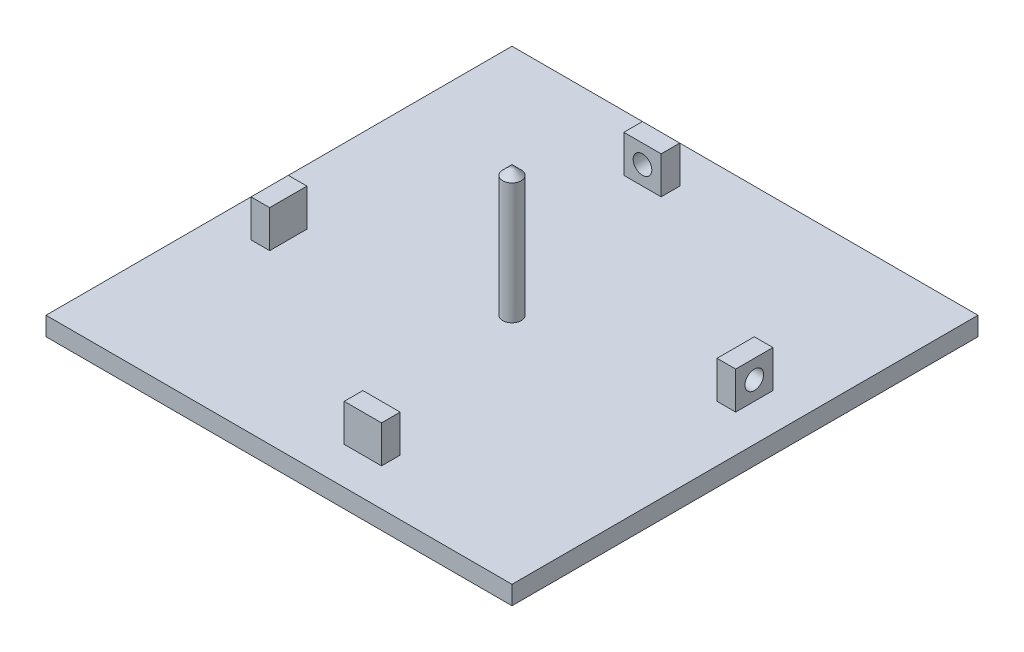
ISO-10303-21;
HEADER;
FILE_DESCRIPTION(('STEP AP214'),'2;1');
FILE_NAME('part.step','',(''),(''),'','','');
FILE_SCHEMA(('AUTOMOTIVE_DESIGN { 1 0 10303 214 1 1 1 1 }'));
ENDSEC;
DATA;
#1=APPLICATION_CONTEXT('core data for automotive mechanical design processes');
#2=APPLICATION_PROTOCOL_DEFINITION('international standard','automotive_design',2000,#1);
#3=PRODUCT_CONTEXT('',#1,'mechanical');
#4=PRODUCT('Part','Part','',(#3));
#5=PRODUCT_RELATED_PRODUCT_CATEGORY('part','',(#4));
#6=PRODUCT_DEFINITION_FORMATION('','',#4);
#7=PRODUCT_DEFINITION_CONTEXT('part definition',#1,'design');
#8=PRODUCT_DEFINITION('design','',#6,#7);
#9=PRODUCT_DEFINITION_SHAPE('','',#8);
#10=(LENGTH_UNIT() NAMED_UNIT(*) SI_UNIT(.MILLI.,.METRE.));
#11=(NAMED_UNIT(*) PLANE_ANGLE_UNIT() SI_UNIT($,.RADIAN.));
#12=(NAMED_UNIT(*) SI_UNIT($,.STERADIAN.) SOLID_ANGLE_UNIT());
#13=UNCERTAINTY_MEASURE_WITH_UNIT(LENGTH_MEASURE(1.E-05),#10,'distance_accuracy_value','');
#14=(GEOMETRIC_REPRESENTATION_CONTEXT(3) GLOBAL_UNCERTAINTY_ASSIGNED_CONTEXT((#13)) GLOBAL_UNIT_ASSIGNED_CONTEXT((#10,
#11,#12)) REPRESENTATION_CONTEXT('',''));
#15=CARTESIAN_POINT('',(0.,0.,0.));
#16=DIRECTION('',(0.,0.,1.));
#17=DIRECTION('',(1.,0.,0.));
#18=AXIS2_PLACEMENT_3D('',#15,#16,#17);
#19=CARTESIAN_POINT('',(0.,0.,0.));
#20=DIRECTION('',(0.,1.,0.));
#21=DIRECTION('',(0.,0.,1.));
#22=AXIS2_PLACEMENT_3D('',#19,#20,#21);
#23=PLANE('',#22);
#24=CARTESIAN_POINT('',(0.,0.,0.));
#25=DIRECTION('',(0.,1.,0.));
#26=DIRECTION('',(0.,0.,1.));
#27=AXIS2_PLACEMENT_3D('',#24,#25,#26);
#28=CIRCLE('',#27,9.99999999999999);
#29=CARTESIAN_POINT('',(0.,0.,9.99999999999999));
#30=VERTEX_POINT('',#29);
#31=EDGE_CURVE('E11',#30,#30,#28,.T.);
#32=ORIENTED_EDGE('',*,*,#31,.F.);
#33=EDGE_LOOP('',(#32));
#34=FACE_BOUND('',#33,.T.);
#35=DIRECTION('',(0.,0.,1.));
#36=VECTOR('',#35,1.);
#37=CARTESIAN_POINT('',(-29.9999999999997,0.,0.));
#38=LINE('',#37,#36);
#39=CARTESIAN_POINT('',(-30.,0.,-210.));
#40=VERTEX_POINT('',#39);
#41=CARTESIAN_POINT('',(-30.,0.,-190.));
#42=VERTEX_POINT('',#41);
#43=EDGE_CURVE('E290',#40,#42,#38,.T.);
#44=ORIENTED_EDGE('',*,*,#43,.T.);
#45=DIRECTION('',(1.,0.,0.));
#46=VECTOR('',#45,1.);
#47=CARTESIAN_POINT('',(-1.31838984174237E-13,0.,-190.));
#48=LINE('',#47,#46);
#49=CARTESIAN_POINT('',(-70.,0.,-190.));
#50=VERTEX_POINT('',#49);
#51=EDGE_CURVE('E296',#50,#42,#48,.T.);
#52=ORIENTED_EDGE('',*,*,#51,.F.);
#53=DIRECTION('',(0.,0.,1.));
#54=VECTOR('',#53,1.);
#55=CARTESIAN_POINT('',(-70.,0.,0.));
#56=LINE('',#55,#54);
#57=CARTESIAN_POINT('',(-70.,0.,-210.));
#58=VERTEX_POINT('',#57);
#59=EDGE_CURVE('E314',#58,#50,#56,.T.);
#60=ORIENTED_EDGE('',*,*,#59,.F.);
#61=DIRECTION('',(1.,0.,0.));
#62=VECTOR('',#61,1.);
#63=CARTESIAN_POINT('',(0.,0.,-210.));
#64=LINE('',#63,#62);
#65=EDGE_CURVE('E310',#58,#40,#64,.T.);
#66=ORIENTED_EDGE('',*,*,#65,.T.);
#67=EDGE_LOOP('',(#44,#52,#60,#66));
#68=FACE_BOUND('',#67,.T.);
#69=DIRECTION('',(1.,0.,0.));
#70=VECTOR('',#69,1.);
#71=CARTESIAN_POINT('',(-250.,0.,250.));
#72=LINE('',#71,#70);
#73=CARTESIAN_POINT('',(-250.,0.,250.));
#74=VERTEX_POINT('',#73);
#75=CARTESIAN_POINT('',(250.,0.,250.));
#76=VERTEX_POINT('',#75);
#77=EDGE_CURVE('E377',#74,#76,#72,.T.);
#78=ORIENTED_EDGE('',*,*,#77,.T.);
#79=DIRECTION('',(0.,0.,-1.));
#80=VECTOR('',#79,1.);
#81=CARTESIAN_POINT('',(250.,0.,250.));
#82=LINE('',#81,#80);
#83=CARTESIAN_POINT('',(250.,0.,-250.));
#84=VERTEX_POINT('',#83);
#85=EDGE_CURVE('E397',#76,#84,#82,.T.);
#86=ORIENTED_EDGE('',*,*,#85,.T.);
#87=DIRECTION('',(1.,0.,0.));
#88=VECTOR('',#87,1.);
#89=CARTESIAN_POINT('',(-250.,0.,-250.));
#90=LINE('',#89,#88);
#91=CARTESIAN_POINT('',(-250.,0.,-250.));
#92=VERTEX_POINT('',#91);
#93=EDGE_CURVE('E401',#92,#84,#90,.T.);
#94=ORIENTED_EDGE('',*,*,#93,.F.);
#95=DIRECTION('',(0.,0.,-1.));
#96=VECTOR('',#95,1.);
#97=CARTESIAN_POINT('',(-250.,0.,250.));
#98=LINE('',#97,#96);
#99=EDGE_CURVE('E383',#74,#92,#98,.T.);
#100=ORIENTED_EDGE('',*,*,#99,.F.);
#101=EDGE_LOOP('',(#78,#86,#94,#100));
#102=FACE_BOUND('',#101,.T.);
#103=DIRECTION('',(0.,0.,-1.));
#104=VECTOR('',#103,1.);
#105=CARTESIAN_POINT('',(-190.,0.,1.31838984174237E-13));
#106=LINE('',#105,#104);
#107=CARTESIAN_POINT('',(-190.,0.,70.0000000000001));
#108=VERTEX_POINT('',#107);
#109=CARTESIAN_POINT('',(-190.,0.,30.));
#110=VERTEX_POINT('',#109);
#111=EDGE_CURVE('E353',#108,#110,#106,.T.);
#112=ORIENTED_EDGE('',*,*,#111,.F.);
#113=DIRECTION('',(1.,0.,0.));
#114=VECTOR('',#113,1.);
#115=CARTESIAN_POINT('',(0.,0.,70.0000000000001));
#116=LINE('',#115,#114);
#117=CARTESIAN_POINT('',(-210.,0.,70.0000000000001));
#118=VERTEX_POINT('',#117);
#119=EDGE_CURVE('E332',#118,#108,#116,.T.);
#120=ORIENTED_EDGE('',*,*,#119,.F.);
#121=DIRECTION('',(0.,0.,-1.));
#122=VECTOR('',#121,1.);
#123=CARTESIAN_POINT('',(-210.,0.,0.));
#124=LINE('',#123,#122);
#125=CARTESIAN_POINT('',(-210.,0.,30.0000000000001));
#126=VERTEX_POINT('',#125);
#127=EDGE_CURVE('E338',#118,#126,#124,.T.);
#128=ORIENTED_EDGE('',*,*,#127,.T.);
#129=DIRECTION('',(1.,0.,0.));
#130=VECTOR('',#129,1.);
#131=CARTESIAN_POINT('',(0.,0.,29.9999999999997));
#132=LINE('',#131,#130);
#133=EDGE_CURVE('E357',#126,#110,#132,.T.);
#134=ORIENTED_EDGE('',*,*,#133,.T.);
#135=EDGE_LOOP('',(#112,#120,#128,#134));
#136=FACE_BOUND('',#135,.T.);
#137=DIRECTION('',(0.,0.,1.));
#138=VECTOR('',#137,1.);
#139=CARTESIAN_POINT('',(190.,0.,-1.31838984174237E-13));
#140=LINE('',#139,#138);
#141=CARTESIAN_POINT('',(190.,0.,-70.));
#142=VERTEX_POINT('',#141);
#143=CARTESIAN_POINT('',(190.,0.,-30.));
#144=VERTEX_POINT('',#143);
#145=EDGE_CURVE('E266',#142,#144,#140,.T.);
#146=ORIENTED_EDGE('',*,*,#145,.F.);
#147=DIRECTION('',(-1.,0.,0.));
#148=VECTOR('',#147,1.);
#149=CARTESIAN_POINT('',(0.,0.,-70.));
#150=LINE('',#149,#148);
#151=CARTESIAN_POINT('',(210.,0.,-70.));
#152=VERTEX_POINT('',#151);
#153=EDGE_CURVE('E245',#152,#142,#150,.T.);
#154=ORIENTED_EDGE('',*,*,#153,.F.);
#155=DIRECTION('',(0.,0.,1.));
#156=VECTOR('',#155,1.);
#157=CARTESIAN_POINT('',(210.,0.,0.));
#158=LINE('',#157,#156);
#159=CARTESIAN_POINT('',(210.,0.,-30.));
#160=VERTEX_POINT('',#159);
#161=EDGE_CURVE('E251',#152,#160,#158,.T.);
#162=ORIENTED_EDGE('',*,*,#161,.T.);
#163=DIRECTION('',(-1.,0.,0.));
#164=VECTOR('',#163,1.);
#165=CARTESIAN_POINT('',(0.,0.,-29.9999999999997));
#166=LINE('',#165,#164);
#167=EDGE_CURVE('E270',#160,#144,#166,.T.);
#168=ORIENTED_EDGE('',*,*,#167,.T.);
#169=EDGE_LOOP('',(#146,#154,#162,#168));
#170=FACE_BOUND('',#169,.T.);
#171=DIRECTION('',(-1.,0.,0.));
#172=VECTOR('',#171,1.);
#173=CARTESIAN_POINT('',(1.31838984174237E-13,0.,190.));
#174=LINE('',#173,#172);
#175=CARTESIAN_POINT('',(70.,0.,190.));
#176=VERTEX_POINT('',#175);
#177=CARTESIAN_POINT('',(30.,0.,190.));
#178=VERTEX_POINT('',#177);
#179=EDGE_CURVE('E57',#176,#178,#174,.T.);
#180=ORIENTED_EDGE('',*,*,#179,.F.);
#181=DIRECTION('',(0.,0.,-1.));
#182=VECTOR('',#181,1.);
#183=CARTESIAN_POINT('',(70.,0.,0.));
#184=LINE('',#183,#182);
#185=CARTESIAN_POINT('',(70.,0.,210.));
#186=VERTEX_POINT('',#185);
#187=EDGE_CURVE('E222',#186,#176,#184,.T.);
#188=ORIENTED_EDGE('',*,*,#187,.F.);
#189=DIRECTION('',(-1.,0.,0.));
#190=VECTOR('',#189,1.);
#191=CARTESIAN_POINT('',(0.,0.,210.));
#192=LINE('',#191,#190);
#193=CARTESIAN_POINT('',(30.,0.,210.));
#194=VERTEX_POINT('',#193);
#195=EDGE_CURVE('E210',#186,#194,#192,.T.);
#196=ORIENTED_EDGE('',*,*,#195,.T.);
#197=DIRECTION('',(0.,0.,-1.));
#198=VECTOR('',#197,1.);
#199=CARTESIAN_POINT('',(29.9999999999997,0.,0.));
#200=LINE('',#199,#198);
#201=EDGE_CURVE('E62',#194,#178,#200,.T.);
#202=ORIENTED_EDGE('',*,*,#201,.T.);
#203=EDGE_LOOP('',(#180,#188,#196,#202));
#204=FACE_BOUND('',#203,.T.);
#205=ADVANCED_FACE('F41',(#34,#68,#102,#136,#170,#204),#23,.T.);
#206=CARTESIAN_POINT('',(-250.,-20.,250.));
#207=DIRECTION('',(0.,0.,1.));
#208=DIRECTION('',(1.,0.,0.));
#209=AXIS2_PLACEMENT_3D('',#206,#207,#208);
#210=PLANE('',#209);
#211=ORIENTED_EDGE('',*,*,#77,.F.);
#212=DIRECTION('',(0.,1.,0.));
#213=VECTOR('',#212,1.);
#214=CARTESIAN_POINT('',(-250.,-20.,250.));
#215=LINE('',#214,#213);
#216=CARTESIAN_POINT('',(-250.,-20.,250.));
#217=VERTEX_POINT('',#216);
#218=EDGE_CURVE('E50',#217,#74,#215,.T.);
#219=ORIENTED_EDGE('',*,*,#218,.F.);
#220=DIRECTION('',(1.,0.,0.));
#221=VECTOR('',#220,1.);
#222=CARTESIAN_POINT('',(-250.,-20.,250.));
#223=LINE('',#222,#221);
#224=CARTESIAN_POINT('',(250.,-20.,250.));
#225=VERTEX_POINT('',#224);
#226=EDGE_CURVE('E378',#217,#225,#223,.T.);
#227=ORIENTED_EDGE('',*,*,#226,.T.);
#228=DIRECTION('',(0.,1.,0.));
#229=VECTOR('',#228,1.);
#230=CARTESIAN_POINT('',(250.,-20.,250.));
#231=LINE('',#230,#229);
#232=EDGE_CURVE('E393',#225,#76,#231,.T.);
#233=ORIENTED_EDGE('',*,*,#232,.T.);
#234=EDGE_LOOP('',(#211,#219,#227,#233));
#235=FACE_BOUND('',#234,.T.);
#236=ADVANCED_FACE('F43',(#235),#210,.T.);
#237=CARTESIAN_POINT('',(-250.,-20.,250.));
#238=DIRECTION('',(1.,0.,0.));
#239=DIRECTION('',(0.,0.,-1.));
#240=AXIS2_PLACEMENT_3D('',#237,#238,#239);
#241=PLANE('',#240);
#242=ORIENTED_EDGE('',*,*,#99,.T.);
#243=DIRECTION('',(0.,1.,0.));
#244=VECTOR('',#243,1.);
#245=CARTESIAN_POINT('',(-250.,-20.,-250.));
#246=LINE('',#245,#244);
#247=CARTESIAN_POINT('',(-250.,-20.,-250.));
#248=VERTEX_POINT('',#247);
#249=EDGE_CURVE('E409',#248,#92,#246,.T.);
#250=ORIENTED_EDGE('',*,*,#249,.F.);
#251=DIRECTION('',(0.,0.,-1.));
#252=VECTOR('',#251,1.);
#253=CARTESIAN_POINT('',(-250.,-20.,250.));
#254=LINE('',#253,#252);
#255=EDGE_CURVE('E390',#217,#248,#254,.T.);
#256=ORIENTED_EDGE('',*,*,#255,.F.);
#257=ORIENTED_EDGE('',*,*,#218,.T.);
#258=EDGE_LOOP('',(#242,#250,#256,#257));
#259=FACE_BOUND('',#258,.T.);
#260=ADVANCED_FACE('F444',(#259),#241,.F.);
#261=CARTESIAN_POINT('',(-250.,-20.,-250.));
#262=DIRECTION('',(0.,0.,1.));
#263=DIRECTION('',(1.,0.,0.));
#264=AXIS2_PLACEMENT_3D('',#261,#262,#263);
#265=PLANE('',#264);
#266=ORIENTED_EDGE('',*,*,#93,.T.);
#267=DIRECTION('',(0.,1.,0.));
#268=VECTOR('',#267,1.);
#269=CARTESIAN_POINT('',(250.,-20.,-250.));
#270=LINE('',#269,#268);
#271=CARTESIAN_POINT('',(250.,-20.,-250.));
#272=VERTEX_POINT('',#271);
#273=EDGE_CURVE('E413',#272,#84,#270,.T.);
#274=ORIENTED_EDGE('',*,*,#273,.F.);
#275=DIRECTION('',(1.,0.,0.));
#276=VECTOR('',#275,1.);
#277=CARTESIAN_POINT('',(-250.,-20.,-250.));
#278=LINE('',#277,#276);
#279=EDGE_CURVE('E387',#248,#272,#278,.T.);
#280=ORIENTED_EDGE('',*,*,#279,.F.);
#281=ORIENTED_EDGE('',*,*,#249,.T.);
#282=EDGE_LOOP('',(#266,#274,#280,#281));
#283=FACE_BOUND('',#282,.T.);
#284=ADVANCED_FACE('F454',(#283),#265,.F.);
#285=CARTESIAN_POINT('',(250.,-20.,250.));
#286=DIRECTION('',(1.,0.,0.));
#287=DIRECTION('',(0.,0.,-1.));
#288=AXIS2_PLACEMENT_3D('',#285,#286,#287);
#289=PLANE('',#288);
#290=ORIENTED_EDGE('',*,*,#85,.F.);
#291=ORIENTED_EDGE('',*,*,#232,.F.);
#292=DIRECTION('',(0.,0.,-1.));
#293=VECTOR('',#292,1.);
#294=CARTESIAN_POINT('',(250.,-20.,250.));
#295=LINE('',#294,#293);
#296=EDGE_CURVE('E382',#225,#272,#295,.T.);
#297=ORIENTED_EDGE('',*,*,#296,.T.);
#298=ORIENTED_EDGE('',*,*,#273,.T.);
#299=EDGE_LOOP('',(#290,#291,#297,#298));
#300=FACE_BOUND('',#299,.T.);
#301=ADVANCED_FACE('F457',(#300),#289,.T.);
#302=CARTESIAN_POINT('',(0.,-20.,0.));
#303=DIRECTION('',(0.,1.,0.));
#304=DIRECTION('',(0.,0.,1.));
#305=AXIS2_PLACEMENT_3D('',#302,#303,#304);
#306=PLANE('',#305);
#307=ORIENTED_EDGE('',*,*,#226,.F.);
#308=ORIENTED_EDGE('',*,*,#255,.T.);
#309=ORIENTED_EDGE('',*,*,#279,.T.);
#310=ORIENTED_EDGE('',*,*,#296,.F.);
#311=EDGE_LOOP('',(#307,#308,#309,#310));
#312=FACE_BOUND('',#311,.T.);
#313=ADVANCED_FACE('F450',(#312),#306,.F.);
#314=CARTESIAN_POINT('',(0.,40.,70.0000000000001));
#315=DIRECTION('',(0.,0.,-1.));
#316=DIRECTION('',(-1.,0.,0.));
#317=AXIS2_PLACEMENT_3D('',#314,#315,#316);
#318=PLANE('',#317);
#319=ORIENTED_EDGE('',*,*,#119,.T.);
#320=DIRECTION('',(0.,-1.,0.));
#321=VECTOR('',#320,1.);
#322=CARTESIAN_POINT('',(-190.,40.,70.0000000000001));
#323=LINE('',#322,#321);
#324=CARTESIAN_POINT('',(-190.,40.,70.0000000000001));
#325=VERTEX_POINT('',#324);
#326=EDGE_CURVE('E373',#325,#108,#323,.T.);
#327=ORIENTED_EDGE('',*,*,#326,.F.);
#328=DIRECTION('',(1.,0.,0.));
#329=VECTOR('',#328,1.);
#330=CARTESIAN_POINT('',(0.,40.,70.0000000000001));
#331=LINE('',#330,#329);
#332=CARTESIAN_POINT('',(-210.,40.,70.0000000000001));
#333=VERTEX_POINT('',#332);
#334=EDGE_CURVE('E333',#333,#325,#331,.T.);
#335=ORIENTED_EDGE('',*,*,#334,.F.);
#336=DIRECTION('',(0.,-1.,0.));
#337=VECTOR('',#336,1.);
#338=CARTESIAN_POINT('',(-210.,40.,70.0000000000001));
#339=LINE('',#338,#337);
#340=EDGE_CURVE('E349',#333,#118,#339,.T.);
#341=ORIENTED_EDGE('',*,*,#340,.T.);
#342=EDGE_LOOP('',(#319,#327,#335,#341));
#343=FACE_BOUND('',#342,.T.);
#344=ADVANCED_FACE('F464',(#343),#318,.F.);
#345=CARTESIAN_POINT('',(-190.,40.,1.31838984174237E-13));
#346=DIRECTION('',(-1.,0.,0.));
#347=DIRECTION('',(0.,0.,1.));
#348=AXIS2_PLACEMENT_3D('',#345,#346,#347);
#349=PLANE('',#348);
#350=ORIENTED_EDGE('',*,*,#111,.T.);
#351=DIRECTION('',(0.,-1.,0.));
#352=VECTOR('',#351,1.);
#353=CARTESIAN_POINT('',(-190.,40.,30.));
#354=LINE('',#353,#352);
#355=CARTESIAN_POINT('',(-190.,40.,30.));
#356=VERTEX_POINT('',#355);
#357=EDGE_CURVE('E369',#356,#110,#354,.T.);
#358=ORIENTED_EDGE('',*,*,#357,.F.);
#359=DIRECTION('',(0.,0.,-1.));
#360=VECTOR('',#359,1.);
#361=CARTESIAN_POINT('',(-190.,40.,1.31838984174237E-13));
#362=LINE('',#361,#360);
#363=EDGE_CURVE('E337',#325,#356,#362,.T.);
#364=ORIENTED_EDGE('',*,*,#363,.F.);
#365=ORIENTED_EDGE('',*,*,#326,.T.);
#366=EDGE_LOOP('',(#350,#358,#364,#365));
#367=FACE_BOUND('',#366,.T.);
#368=ADVANCED_FACE('F546',(#367),#349,.F.);
#369=CARTESIAN_POINT('',(0.,40.,29.9999999999997));
#370=DIRECTION('',(0.,0.,-1.));
#371=DIRECTION('',(-1.,0.,0.));
#372=AXIS2_PLACEMENT_3D('',#369,#370,#371);
#373=PLANE('',#372);
#374=ORIENTED_EDGE('',*,*,#133,.F.);
#375=DIRECTION('',(0.,-1.,0.));
#376=VECTOR('',#375,1.);
#377=CARTESIAN_POINT('',(-210.,40.,30.0000000000001));
#378=LINE('',#377,#376);
#379=CARTESIAN_POINT('',(-210.,40.,30.0000000000001));
#380=VERTEX_POINT('',#379);
#381=EDGE_CURVE('E365',#380,#126,#378,.T.);
#382=ORIENTED_EDGE('',*,*,#381,.F.);
#383=DIRECTION('',(1.,0.,0.));
#384=VECTOR('',#383,1.);
#385=CARTESIAN_POINT('',(0.,40.,29.9999999999997));
#386=LINE('',#385,#384);
#387=EDGE_CURVE('E341',#380,#356,#386,.T.);
#388=ORIENTED_EDGE('',*,*,#387,.T.);
#389=ORIENTED_EDGE('',*,*,#357,.T.);
#390=EDGE_LOOP('',(#374,#382,#388,#389));
#391=FACE_BOUND('',#390,.T.);
#392=ADVANCED_FACE('F542',(#391),#373,.T.);
#393=CARTESIAN_POINT('',(-210.,40.,0.));
#394=DIRECTION('',(-1.,0.,0.));
#395=DIRECTION('',(0.,0.,1.));
#396=AXIS2_PLACEMENT_3D('',#393,#394,#395);
#397=PLANE('',#396);
#398=ORIENTED_EDGE('',*,*,#127,.F.);
#399=ORIENTED_EDGE('',*,*,#340,.F.);
#400=DIRECTION('',(0.,0.,-1.));
#401=VECTOR('',#400,1.);
#402=CARTESIAN_POINT('',(-210.,40.,0.));
#403=LINE('',#402,#401);
#404=EDGE_CURVE('E345',#333,#380,#403,.T.);
#405=ORIENTED_EDGE('',*,*,#404,.T.);
#406=ORIENTED_EDGE('',*,*,#381,.T.);
#407=EDGE_LOOP('',(#398,#399,#405,#406));
#408=FACE_BOUND('',#407,.T.);
#409=ADVANCED_FACE('F538',(#408),#397,.T.);
#410=CARTESIAN_POINT('',(0.,40.,0.));
#411=DIRECTION('',(0.,1.,0.));
#412=DIRECTION('',(0.,0.,1.));
#413=AXIS2_PLACEMENT_3D('',#410,#411,#412);
#414=PLANE('',#413);
#415=ORIENTED_EDGE('',*,*,#334,.T.);
#416=ORIENTED_EDGE('',*,*,#363,.T.);
#417=ORIENTED_EDGE('',*,*,#387,.F.);
#418=ORIENTED_EDGE('',*,*,#404,.F.);
#419=EDGE_LOOP('',(#415,#416,#417,#418));
#420=FACE_BOUND('',#419,.T.);
#421=ADVANCED_FACE('F534',(#420),#414,.T.);
#422=CARTESIAN_POINT('',(-29.9999999999997,40.,0.));
#423=DIRECTION('',(1.,0.,0.));
#424=DIRECTION('',(0.,0.,-1.));
#425=AXIS2_PLACEMENT_3D('',#422,#423,#424);
#426=PLANE('',#425);
#427=ORIENTED_EDGE('',*,*,#43,.F.);
#428=DIRECTION('',(0.,-1.,0.));
#429=VECTOR('',#428,1.);
#430=CARTESIAN_POINT('',(-30.,40.,-210.));
#431=LINE('',#430,#429);
#432=CARTESIAN_POINT('',(-30.,40.,-210.));
#433=VERTEX_POINT('',#432);
#434=EDGE_CURVE('E329',#433,#40,#431,.T.);
#435=ORIENTED_EDGE('',*,*,#434,.F.);
#436=DIRECTION('',(0.,0.,1.));
#437=VECTOR('',#436,1.);
#438=CARTESIAN_POINT('',(-29.9999999999997,40.,0.));
#439=LINE('',#438,#437);
#440=CARTESIAN_POINT('',(-30.,40.,-190.));
#441=VERTEX_POINT('',#440);
#442=EDGE_CURVE('E291',#433,#441,#439,.T.);
#443=ORIENTED_EDGE('',*,*,#442,.T.);
#444=DIRECTION('',(0.,-1.,0.));
#445=VECTOR('',#444,1.);
#446=CARTESIAN_POINT('',(-30.,40.,-190.));
#447=LINE('',#446,#445);
#448=EDGE_CURVE('E306',#441,#42,#447,.T.);
#449=ORIENTED_EDGE('',*,*,#448,.T.);
#450=EDGE_LOOP('',(#427,#435,#443,#449));
#451=FACE_BOUND('',#450,.T.);
#452=ADVANCED_FACE('F530',(#451),#426,.T.);
#453=CARTESIAN_POINT('',(0.,40.,-210.));
#454=DIRECTION('',(0.,0.,-1.));
#455=DIRECTION('',(-1.,0.,0.));
#456=AXIS2_PLACEMENT_3D('',#453,#454,#455);
#457=PLANE('',#456);
#458=CARTESIAN_POINT('',(-50.,20.,-210.));
#459=DIRECTION('',(0.,0.,-1.));
#460=DIRECTION('',(-1.,0.,0.));
#461=AXIS2_PLACEMENT_3D('',#458,#459,#460);
#462=CIRCLE('',#461,10.);
#463=CARTESIAN_POINT('',(-60.,20.,-210.));
#464=VERTEX_POINT('',#463);
#465=EDGE_CURVE('E200',#464,#464,#462,.T.);
#466=ORIENTED_EDGE('',*,*,#465,.F.);
#467=EDGE_LOOP('',(#466));
#468=FACE_BOUND('',#467,.T.);
#469=ORIENTED_EDGE('',*,*,#65,.F.);
#470=DIRECTION('',(0.,-1.,0.));
#471=VECTOR('',#470,1.);
#472=CARTESIAN_POINT('',(-70.,40.,-210.));
#473=LINE('',#472,#471);
#474=CARTESIAN_POINT('',(-70.,40.,-210.));
#475=VERTEX_POINT('',#474);
#476=EDGE_CURVE('E326',#475,#58,#473,.T.);
#477=ORIENTED_EDGE('',*,*,#476,.F.);
#478=DIRECTION('',(1.,0.,0.));
#479=VECTOR('',#478,1.);
#480=CARTESIAN_POINT('',(0.,40.,-210.));
#481=LINE('',#480,#479);
#482=EDGE_CURVE('E295',#475,#433,#481,.T.);
#483=ORIENTED_EDGE('',*,*,#482,.T.);
#484=ORIENTED_EDGE('',*,*,#434,.T.);
#485=EDGE_LOOP('',(#469,#477,#483,#484));
#486=FACE_BOUND('',#485,.T.);
#487=ADVANCED_FACE('F526',(#468,#486),#457,.T.);
#488=CARTESIAN_POINT('',(-70.,40.,0.));
#489=DIRECTION('',(1.,0.,0.));
#490=DIRECTION('',(0.,0.,-1.));
#491=AXIS2_PLACEMENT_3D('',#488,#489,#490);
#492=PLANE('',#491);
#493=ORIENTED_EDGE('',*,*,#59,.T.);
#494=DIRECTION('',(0.,-1.,0.));
#495=VECTOR('',#494,1.);
#496=CARTESIAN_POINT('',(-70.,40.,-190.));
#497=LINE('',#496,#495);
#498=CARTESIAN_POINT('',(-70.,40.,-190.));
#499=VERTEX_POINT('',#498);
#500=EDGE_CURVE('E323',#499,#50,#497,.T.);
#501=ORIENTED_EDGE('',*,*,#500,.F.);
#502=DIRECTION('',(0.,0.,1.));
#503=VECTOR('',#502,1.);
#504=CARTESIAN_POINT('',(-70.,40.,0.));
#505=LINE('',#504,#503);
#506=EDGE_CURVE('E300',#475,#499,#505,.T.);
#507=ORIENTED_EDGE('',*,*,#506,.F.);
#508=ORIENTED_EDGE('',*,*,#476,.T.);
#509=EDGE_LOOP('',(#493,#501,#507,#508));
#510=FACE_BOUND('',#509,.T.);
#511=ADVANCED_FACE('F523',(#510),#492,.F.);
#512=CARTESIAN_POINT('',(-1.31838984174237E-13,40.,-190.));
#513=DIRECTION('',(0.,0.,-1.));
#514=DIRECTION('',(-1.,0.,0.));
#515=AXIS2_PLACEMENT_3D('',#512,#513,#514);
#516=PLANE('',#515);
#517=CARTESIAN_POINT('',(-50.,20.,-190.));
#518=DIRECTION('',(0.,0.,-1.));
#519=DIRECTION('',(-1.,0.,0.));
#520=AXIS2_PLACEMENT_3D('',#517,#518,#519);
#521=CIRCLE('',#520,10.);
#522=CARTESIAN_POINT('',(-60.,20.,-190.));
#523=VERTEX_POINT('',#522);
#524=EDGE_CURVE('E204',#523,#523,#521,.T.);
#525=ORIENTED_EDGE('',*,*,#524,.T.);
#526=EDGE_LOOP('',(#525));
#527=FACE_BOUND('',#526,.T.);
#528=ORIENTED_EDGE('',*,*,#51,.T.);
#529=ORIENTED_EDGE('',*,*,#448,.F.);
#530=DIRECTION('',(1.,0.,0.));
#531=VECTOR('',#530,1.);
#532=CARTESIAN_POINT('',(-1.31838984174237E-13,40.,-190.));
#533=LINE('',#532,#531);
#534=EDGE_CURVE('E303',#499,#441,#533,.T.);
#535=ORIENTED_EDGE('',*,*,#534,.F.);
#536=ORIENTED_EDGE('',*,*,#500,.T.);
#537=EDGE_LOOP('',(#528,#529,#535,#536));
#538=FACE_BOUND('',#537,.T.);
#539=ADVANCED_FACE('F421',(#527,#538),#516,.F.);
#540=CARTESIAN_POINT('',(0.,40.,0.));
#541=DIRECTION('',(0.,1.,0.));
#542=DIRECTION('',(0.,0.,1.));
#543=AXIS2_PLACEMENT_3D('',#540,#541,#542);
#544=PLANE('',#543);
#545=ORIENTED_EDGE('',*,*,#442,.F.);
#546=ORIENTED_EDGE('',*,*,#482,.F.);
#547=ORIENTED_EDGE('',*,*,#506,.T.);
#548=ORIENTED_EDGE('',*,*,#534,.T.);
#549=EDGE_LOOP('',(#545,#546,#547,#548));
#550=FACE_BOUND('',#549,.T.);
#551=ADVANCED_FACE('F517',(#550),#544,.T.);
#552=CARTESIAN_POINT('',(0.,40.,-70.));
#553=DIRECTION('',(0.,0.,1.));
#554=DIRECTION('',(1.,0.,0.));
#555=AXIS2_PLACEMENT_3D('',#552,#553,#554);
#556=PLANE('',#555);
#557=ORIENTED_EDGE('',*,*,#153,.T.);
#558=DIRECTION('',(0.,-1.,0.));
#559=VECTOR('',#558,1.);
#560=CARTESIAN_POINT('',(190.,40.,-70.));
#561=LINE('',#560,#559);
#562=CARTESIAN_POINT('',(190.,40.,-70.));
#563=VERTEX_POINT('',#562);
#564=EDGE_CURVE('E286',#563,#142,#561,.T.);
#565=ORIENTED_EDGE('',*,*,#564,.F.);
#566=DIRECTION('',(-1.,0.,0.));
#567=VECTOR('',#566,1.);
#568=CARTESIAN_POINT('',(0.,40.,-70.));
#569=LINE('',#568,#567);
#570=CARTESIAN_POINT('',(210.,40.,-70.));
#571=VERTEX_POINT('',#570);
#572=EDGE_CURVE('E246',#571,#563,#569,.T.);
#573=ORIENTED_EDGE('',*,*,#572,.F.);
#574=DIRECTION('',(0.,-1.,0.));
#575=VECTOR('',#574,1.);
#576=CARTESIAN_POINT('',(210.,40.,-70.));
#577=LINE('',#576,#575);
#578=EDGE_CURVE('E262',#571,#152,#577,.T.);
#579=ORIENTED_EDGE('',*,*,#578,.T.);
#580=EDGE_LOOP('',(#557,#565,#573,#579));
#581=FACE_BOUND('',#580,.T.);
#582=ADVANCED_FACE('F486',(#581),#556,.F.);
#583=CARTESIAN_POINT('',(190.,40.,-1.31838984174237E-13));
#584=DIRECTION('',(1.,0.,0.));
#585=DIRECTION('',(0.,0.,-1.));
#586=AXIS2_PLACEMENT_3D('',#583,#584,#585);
#587=PLANE('',#586);
#588=CARTESIAN_POINT('',(190.,20.,-50.));
#589=DIRECTION('',(1.,0.,0.));
#590=DIRECTION('',(0.,0.,-1.));
#591=AXIS2_PLACEMENT_3D('',#588,#589,#590);
#592=CIRCLE('',#591,10.);
#593=CARTESIAN_POINT('',(190.,20.,-60.));
#594=VERTEX_POINT('',#593);
#595=EDGE_CURVE('E194',#594,#594,#592,.T.);
#596=ORIENTED_EDGE('',*,*,#595,.T.);
#597=EDGE_LOOP('',(#596));
#598=FACE_BOUND('',#597,.T.);
#599=ORIENTED_EDGE('',*,*,#145,.T.);
#600=DIRECTION('',(0.,-1.,0.));
#601=VECTOR('',#600,1.);
#602=CARTESIAN_POINT('',(190.,40.,-30.));
#603=LINE('',#602,#601);
#604=CARTESIAN_POINT('',(190.,40.,-30.));
#605=VERTEX_POINT('',#604);
#606=EDGE_CURVE('E282',#605,#144,#603,.T.);
#607=ORIENTED_EDGE('',*,*,#606,.F.);
#608=DIRECTION('',(0.,0.,1.));
#609=VECTOR('',#608,1.);
#610=CARTESIAN_POINT('',(190.,40.,-1.31838984174237E-13));
#611=LINE('',#610,#609);
#612=EDGE_CURVE('E250',#563,#605,#611,.T.);
#613=ORIENTED_EDGE('',*,*,#612,.F.);
#614=ORIENTED_EDGE('',*,*,#564,.T.);
#615=EDGE_LOOP('',(#599,#607,#613,#614));
#616=FACE_BOUND('',#615,.T.);
#617=ADVANCED_FACE('F483',(#598,#616),#587,.F.);
#618=CARTESIAN_POINT('',(0.,40.,-29.9999999999997));
#619=DIRECTION('',(0.,0.,1.));
#620=DIRECTION('',(1.,0.,0.));
#621=AXIS2_PLACEMENT_3D('',#618,#619,#620);
#622=PLANE('',#621);
#623=ORIENTED_EDGE('',*,*,#167,.F.);
#624=DIRECTION('',(0.,-1.,0.));
#625=VECTOR('',#624,1.);
#626=CARTESIAN_POINT('',(210.,40.,-30.));
#627=LINE('',#626,#625);
#628=CARTESIAN_POINT('',(210.,40.,-30.));
#629=VERTEX_POINT('',#628);
#630=EDGE_CURVE('E278',#629,#160,#627,.T.);
#631=ORIENTED_EDGE('',*,*,#630,.F.);
#632=DIRECTION('',(-1.,0.,0.));
#633=VECTOR('',#632,1.);
#634=CARTESIAN_POINT('',(0.,40.,-29.9999999999997));
#635=LINE('',#634,#633);
#636=EDGE_CURVE('E254',#629,#605,#635,.T.);
#637=ORIENTED_EDGE('',*,*,#636,.T.);
#638=ORIENTED_EDGE('',*,*,#606,.T.);
#639=EDGE_LOOP('',(#623,#631,#637,#638));
#640=FACE_BOUND('',#639,.T.);
#641=ADVANCED_FACE('F493',(#640),#622,.T.);
#642=CARTESIAN_POINT('',(210.,40.,0.));
#643=DIRECTION('',(1.,0.,0.));
#644=DIRECTION('',(0.,0.,-1.));
#645=AXIS2_PLACEMENT_3D('',#642,#643,#644);
#646=PLANE('',#645);
#647=CARTESIAN_POINT('',(210.,20.,-50.));
#648=DIRECTION('',(1.,0.,0.));
#649=DIRECTION('',(0.,0.,-1.));
#650=AXIS2_PLACEMENT_3D('',#647,#648,#649);
#651=CIRCLE('',#650,10.);
#652=CARTESIAN_POINT('',(210.,20.,-60.));
#653=VERTEX_POINT('',#652);
#654=EDGE_CURVE('E190',#653,#653,#651,.T.);
#655=ORIENTED_EDGE('',*,*,#654,.F.);
#656=EDGE_LOOP('',(#655));
#657=FACE_BOUND('',#656,.T.);
#658=ORIENTED_EDGE('',*,*,#161,.F.);
#659=ORIENTED_EDGE('',*,*,#578,.F.);
#660=DIRECTION('',(0.,0.,1.));
#661=VECTOR('',#660,1.);
#662=CARTESIAN_POINT('',(210.,40.,0.));
#663=LINE('',#662,#661);
#664=EDGE_CURVE('E258',#571,#629,#663,.T.);
#665=ORIENTED_EDGE('',*,*,#664,.T.);
#666=ORIENTED_EDGE('',*,*,#630,.T.);
#667=EDGE_LOOP('',(#658,#659,#665,#666));
#668=FACE_BOUND('',#667,.T.);
#669=ADVANCED_FACE('F490',(#657,#668),#646,.T.);
#670=CARTESIAN_POINT('',(0.,40.,0.));
#671=DIRECTION('',(0.,1.,0.));
#672=DIRECTION('',(0.,0.,1.));
#673=AXIS2_PLACEMENT_3D('',#670,#671,#672);
#674=PLANE('',#673);
#675=ORIENTED_EDGE('',*,*,#572,.T.);
#676=ORIENTED_EDGE('',*,*,#612,.T.);
#677=ORIENTED_EDGE('',*,*,#636,.F.);
#678=ORIENTED_EDGE('',*,*,#664,.F.);
#679=EDGE_LOOP('',(#675,#676,#677,#678));
#680=FACE_BOUND('',#679,.T.);
#681=ADVANCED_FACE('F495',(#680),#674,.T.);
#682=CARTESIAN_POINT('',(70.,40.,0.));
#683=DIRECTION('',(-1.,0.,0.));
#684=DIRECTION('',(0.,0.,1.));
#685=AXIS2_PLACEMENT_3D('',#682,#683,#684);
#686=PLANE('',#685);
#687=ORIENTED_EDGE('',*,*,#187,.T.);
#688=DIRECTION('',(0.,-1.,0.));
#689=VECTOR('',#688,1.);
#690=CARTESIAN_POINT('',(70.,40.,190.));
#691=LINE('',#690,#689);
#692=CARTESIAN_POINT('',(70.,40.,190.));
#693=VERTEX_POINT('',#692);
#694=EDGE_CURVE('E242',#693,#176,#691,.T.);
#695=ORIENTED_EDGE('',*,*,#694,.F.);
#696=DIRECTION('',(0.,0.,-1.));
#697=VECTOR('',#696,1.);
#698=CARTESIAN_POINT('',(70.,40.,0.));
#699=LINE('',#698,#697);
#700=CARTESIAN_POINT('',(70.,40.,210.));
#701=VERTEX_POINT('',#700);
#702=EDGE_CURVE('E205',#701,#693,#699,.T.);
#703=ORIENTED_EDGE('',*,*,#702,.F.);
#704=DIRECTION('',(0.,-1.,0.));
#705=VECTOR('',#704,1.);
#706=CARTESIAN_POINT('',(70.,40.,210.));
#707=LINE('',#706,#705);
#708=EDGE_CURVE('E221',#701,#186,#707,.T.);
#709=ORIENTED_EDGE('',*,*,#708,.T.);
#710=EDGE_LOOP('',(#687,#695,#703,#709));
#711=FACE_BOUND('',#710,.T.);
#712=ADVANCED_FACE('F497',(#711),#686,.F.);
#713=CARTESIAN_POINT('',(1.31838984174237E-13,40.,190.));
#714=DIRECTION('',(0.,0.,1.));
#715=DIRECTION('',(1.,0.,0.));
#716=AXIS2_PLACEMENT_3D('',#713,#714,#715);
#717=PLANE('',#716);
#718=ORIENTED_EDGE('',*,*,#179,.T.);
#719=DIRECTION('',(0.,-1.,0.));
#720=VECTOR('',#719,1.);
#721=CARTESIAN_POINT('',(30.,40.,190.));
#722=LINE('',#721,#720);
#723=CARTESIAN_POINT('',(30.,40.,190.));
#724=VERTEX_POINT('',#723);
#725=EDGE_CURVE('E239',#724,#178,#722,.T.);
#726=ORIENTED_EDGE('',*,*,#725,.F.);
#727=DIRECTION('',(-1.,0.,0.));
#728=VECTOR('',#727,1.);
#729=CARTESIAN_POINT('',(1.31838984174237E-13,40.,190.));
#730=LINE('',#729,#728);
#731=EDGE_CURVE('E209',#693,#724,#730,.T.);
#732=ORIENTED_EDGE('',*,*,#731,.F.);
#733=ORIENTED_EDGE('',*,*,#694,.T.);
#734=EDGE_LOOP('',(#718,#726,#732,#733));
#735=FACE_BOUND('',#734,.T.);
#736=ADVANCED_FACE('F503',(#735),#717,.F.);
#737=CARTESIAN_POINT('',(29.9999999999997,40.,0.));
#738=DIRECTION('',(-1.,0.,0.));
#739=DIRECTION('',(0.,0.,1.));
#740=AXIS2_PLACEMENT_3D('',#737,#738,#739);
#741=PLANE('',#740);
#742=ORIENTED_EDGE('',*,*,#201,.F.);
#743=DIRECTION('',(0.,-1.,0.));
#744=VECTOR('',#743,1.);
#745=CARTESIAN_POINT('',(30.,40.,210.));
#746=LINE('',#745,#744);
#747=CARTESIAN_POINT('',(30.,40.,210.));
#748=VERTEX_POINT('',#747);
#749=EDGE_CURVE('E235',#748,#194,#746,.T.);
#750=ORIENTED_EDGE('',*,*,#749,.F.);
#751=DIRECTION('',(0.,0.,-1.));
#752=VECTOR('',#751,1.);
#753=CARTESIAN_POINT('',(29.9999999999997,40.,0.));
#754=LINE('',#753,#752);
#755=EDGE_CURVE('E213',#748,#724,#754,.T.);
#756=ORIENTED_EDGE('',*,*,#755,.T.);
#757=ORIENTED_EDGE('',*,*,#725,.T.);
#758=EDGE_LOOP('',(#742,#750,#756,#757));
#759=FACE_BOUND('',#758,.T.);
#760=ADVANCED_FACE('F712',(#759),#741,.T.);
#761=CARTESIAN_POINT('',(0.,40.,210.));
#762=DIRECTION('',(0.,0.,1.));
#763=DIRECTION('',(1.,0.,0.));
#764=AXIS2_PLACEMENT_3D('',#761,#762,#763);
#765=PLANE('',#764);
#766=ORIENTED_EDGE('',*,*,#195,.F.);
#767=ORIENTED_EDGE('',*,*,#708,.F.);
#768=DIRECTION('',(-1.,0.,0.));
#769=VECTOR('',#768,1.);
#770=CARTESIAN_POINT('',(0.,40.,210.));
#771=LINE('',#770,#769);
#772=EDGE_CURVE('E217',#701,#748,#771,.T.);
#773=ORIENTED_EDGE('',*,*,#772,.T.);
#774=ORIENTED_EDGE('',*,*,#749,.T.);
#775=EDGE_LOOP('',(#766,#767,#773,#774));
#776=FACE_BOUND('',#775,.T.);
#777=ADVANCED_FACE('F435',(#776),#765,.T.);
#778=CARTESIAN_POINT('',(0.,40.,0.));
#779=DIRECTION('',(0.,1.,0.));
#780=DIRECTION('',(0.,0.,1.));
#781=AXIS2_PLACEMENT_3D('',#778,#779,#780);
#782=PLANE('',#781);
#783=ORIENTED_EDGE('',*,*,#702,.T.);
#784=ORIENTED_EDGE('',*,*,#731,.T.);
#785=ORIENTED_EDGE('',*,*,#755,.F.);
#786=ORIENTED_EDGE('',*,*,#772,.F.);
#787=EDGE_LOOP('',(#783,#784,#785,#786));
#788=FACE_BOUND('',#787,.T.);
#789=ADVANCED_FACE('F426',(#788),#782,.T.);
#790=CARTESIAN_POINT('',(-50.,20.,250.));
#791=DIRECTION('',(0.,0.,-1.));
#792=DIRECTION('',(-1.,0.,0.));
#793=AXIS2_PLACEMENT_3D('',#790,#791,#792);
#794=CYLINDRICAL_SURFACE('',#793,10.);
#795=CARTESIAN_POINT('',(-60.,20.,-210.));
#796=CARTESIAN_POINT('',(-60.,20.,-209.791666666667));
#797=CARTESIAN_POINT('',(-60.,20.,-209.583333333333));
#798=CARTESIAN_POINT('',(-60.,20.,-209.166666666667));
#799=CARTESIAN_POINT('',(-60.,20.,-208.958333333333));
#800=CARTESIAN_POINT('',(-60.,20.,-208.541666666667));
#801=CARTESIAN_POINT('',(-60.,20.,-208.333333333333));
#802=CARTESIAN_POINT('',(-60.,20.,-207.916666666667));
#803=CARTESIAN_POINT('',(-60.,20.,-207.708333333333));
#804=CARTESIAN_POINT('',(-60.,20.,-207.291666666667));
#805=CARTESIAN_POINT('',(-60.,20.,-207.083333333333));
#806=CARTESIAN_POINT('',(-60.,20.,-206.666666666667));
#807=CARTESIAN_POINT('',(-60.,20.,-206.458333333333));
#808=CARTESIAN_POINT('',(-60.,20.,-206.041666666667));
#809=CARTESIAN_POINT('',(-60.,20.,-205.833333333333));
#810=CARTESIAN_POINT('',(-60.,20.,-205.416666666667));
#811=CARTESIAN_POINT('',(-60.,20.,-205.208333333333));
#812=CARTESIAN_POINT('',(-60.,20.,-204.791666666667));
#813=CARTESIAN_POINT('',(-60.,20.,-204.583333333333));
#814=CARTESIAN_POINT('',(-60.,20.,-204.166666666667));
#815=CARTESIAN_POINT('',(-60.,20.,-203.958333333333));
#816=CARTESIAN_POINT('',(-60.,20.,-203.541666666667));
#817=CARTESIAN_POINT('',(-60.,20.,-203.333333333333));
#818=CARTESIAN_POINT('',(-60.,20.,-202.916666666667));
#819=CARTESIAN_POINT('',(-60.,20.,-202.708333333333));
#820=CARTESIAN_POINT('',(-60.,20.,-202.291666666667));
#821=CARTESIAN_POINT('',(-60.,20.,-202.083333333333));
#822=CARTESIAN_POINT('',(-60.,20.,-201.666666666667));
#823=CARTESIAN_POINT('',(-60.,20.,-201.458333333333));
#824=CARTESIAN_POINT('',(-60.,20.,-201.041666666667));
#825=CARTESIAN_POINT('',(-60.,20.,-200.833333333333));
#826=CARTESIAN_POINT('',(-60.,20.,-200.416666666667));
#827=CARTESIAN_POINT('',(-60.,20.,-200.208333333333));
#828=CARTESIAN_POINT('',(-60.,20.,-199.791666666667));
#829=CARTESIAN_POINT('',(-60.,20.,-199.583333333333));
#830=CARTESIAN_POINT('',(-60.,20.,-199.166666666667));
#831=CARTESIAN_POINT('',(-60.,20.,-198.958333333333));
#832=CARTESIAN_POINT('',(-60.,20.,-198.541666666667));
#833=CARTESIAN_POINT('',(-60.,20.,-198.333333333333));
#834=CARTESIAN_POINT('',(-60.,20.,-197.916666666667));
#835=CARTESIAN_POINT('',(-60.,20.,-197.708333333333));
#836=CARTESIAN_POINT('',(-60.,20.,-197.291666666667));
#837=CARTESIAN_POINT('',(-60.,20.,-197.083333333333));
#838=CARTESIAN_POINT('',(-60.,20.,-196.666666666667));
#839=CARTESIAN_POINT('',(-60.,20.,-196.458333333333));
#840=CARTESIAN_POINT('',(-60.,20.,-196.041666666667));
#841=CARTESIAN_POINT('',(-60.,20.,-195.833333333333));
#842=CARTESIAN_POINT('',(-60.,20.,-195.416666666667));
#843=CARTESIAN_POINT('',(-60.,20.,-195.208333333333));
#844=CARTESIAN_POINT('',(-60.,20.,-194.791666666667));
#845=CARTESIAN_POINT('',(-60.,20.,-194.583333333333));
#846=CARTESIAN_POINT('',(-60.,20.,-194.166666666667));
#847=CARTESIAN_POINT('',(-60.,20.,-193.958333333333));
#848=CARTESIAN_POINT('',(-60.,20.,-193.541666666667));
#849=CARTESIAN_POINT('',(-60.,20.,-193.333333333333));
#850=CARTESIAN_POINT('',(-60.,20.,-192.916666666667));
#851=CARTESIAN_POINT('',(-60.,20.,-192.708333333333));
#852=CARTESIAN_POINT('',(-60.,20.,-192.291666666667));
#853=CARTESIAN_POINT('',(-60.,20.,-192.083333333333));
#854=CARTESIAN_POINT('',(-60.,20.,-191.666666666667));
#855=CARTESIAN_POINT('',(-60.,20.,-191.458333333333));
#856=CARTESIAN_POINT('',(-60.,20.,-191.041666666667));
#857=CARTESIAN_POINT('',(-60.,20.,-190.833333333333));
#858=CARTESIAN_POINT('',(-60.,20.,-190.416666666667));
#859=CARTESIAN_POINT('',(-60.,20.,-190.208333333333));
#860=CARTESIAN_POINT('',(-60.,20.,-190.));
#861=B_SPLINE_CURVE_WITH_KNOTS('',3,(#795,#796,#797,#798,#799,#800,#801,#802,#803,#804,#805,
#806,#807,#808,#809,#810,#811,#812,#813,#814,#815,#816,#817,#818,#819,#820,#821,#822,#823,#824,
#825,#826,#827,#828,#829,#830,#831,#832,#833,#834,#835,#836,#837,#838,#839,#840,#841,#842,#843,
#844,#845,#846,#847,#848,#849,#850,#851,#852,#853,#854,#855,#856,#857,#858,#859,#860),
.UNSPECIFIED.,.F.,.F.,(4,2,2,2,2,2,2,2,2,2,2,2,2,2,2,2,2,2,2,2,2,2,2,2,2,2,2,2,2,2,2,2,4),(0.,
0.624999999999987,1.24999999999997,1.87500000000002,2.5,3.12499999999999,3.75000000000003,
4.37500000000002,5.,5.62499999999999,6.24999999999998,6.87500000000002,7.50000000000001,
8.12499999999999,8.75000000000004,9.37500000000002,10.,10.625,11.25,11.875,12.5,13.125,13.75,
14.375,15.,15.625,16.25,16.875,17.5,18.125,18.75,19.375,20.),.UNSPECIFIED.);
#862=EDGE_CURVE('BSEAM424',#464,#523,#861,.T.);
#863=ORIENTED_EDGE('',*,*,#465,.T.);
#864=ORIENTED_EDGE('',*,*,#524,.F.);
#865=ORIENTED_EDGE('',*,*,#862,.T.);
#866=ORIENTED_EDGE('',*,*,#862,.F.);
#867=EDGE_LOOP('',(#863,#865,#864,#866));
#868=FACE_BOUND('',#867,.T.);
#869=ADVANCED_FACE('F424',(#868),#794,.F.);
#870=CARTESIAN_POINT('',(-250.,20.,-50.));
#871=DIRECTION('',(1.,0.,0.));
#872=DIRECTION('',(0.,0.,-1.));
#873=AXIS2_PLACEMENT_3D('',#870,#871,#872);
#874=CYLINDRICAL_SURFACE('',#873,10.);
#875=CARTESIAN_POINT('',(210.,20.,-60.));
#876=CARTESIAN_POINT('',(209.791666666667,20.,-60.));
#877=CARTESIAN_POINT('',(209.583333333333,20.,-60.));
#878=CARTESIAN_POINT('',(209.166666666667,20.,-60.));
#879=CARTESIAN_POINT('',(208.958333333333,20.,-60.));
#880=CARTESIAN_POINT('',(208.541666666667,20.,-60.));
#881=CARTESIAN_POINT('',(208.333333333333,20.,-60.));
#882=CARTESIAN_POINT('',(207.916666666667,20.,-60.));
#883=CARTESIAN_POINT('',(207.708333333333,20.,-60.));
#884=CARTESIAN_POINT('',(207.291666666667,20.,-60.));
#885=CARTESIAN_POINT('',(207.083333333333,20.,-60.));
#886=CARTESIAN_POINT('',(206.666666666667,20.,-60.));
#887=CARTESIAN_POINT('',(206.458333333333,20.,-60.));
#888=CARTESIAN_POINT('',(206.041666666667,20.,-60.));
#889=CARTESIAN_POINT('',(205.833333333333,20.,-60.));
#890=CARTESIAN_POINT('',(205.416666666667,20.,-60.));
#891=CARTESIAN_POINT('',(205.208333333333,20.,-60.));
#892=CARTESIAN_POINT('',(204.791666666667,20.,-60.));
#893=CARTESIAN_POINT('',(204.583333333333,20.,-60.));
#894=CARTESIAN_POINT('',(204.166666666667,20.,-60.));
#895=CARTESIAN_POINT('',(203.958333333333,20.,-60.));
#896=CARTESIAN_POINT('',(203.541666666667,20.,-60.));
#897=CARTESIAN_POINT('',(203.333333333333,20.,-60.));
#898=CARTESIAN_POINT('',(202.916666666667,20.,-60.));
#899=CARTESIAN_POINT('',(202.708333333333,20.,-60.));
#900=CARTESIAN_POINT('',(202.291666666667,20.,-60.));
#901=CARTESIAN_POINT('',(202.083333333333,20.,-60.));
#902=CARTESIAN_POINT('',(201.666666666667,20.,-60.));
#903=CARTESIAN_POINT('',(201.458333333333,20.,-60.));
#904=CARTESIAN_POINT('',(201.041666666667,20.,-60.));
#905=CARTESIAN_POINT('',(200.833333333333,20.,-60.));
#906=CARTESIAN_POINT('',(200.416666666667,20.,-60.));
#907=CARTESIAN_POINT('',(200.208333333333,20.,-60.));
#908=CARTESIAN_POINT('',(199.791666666667,20.,-60.));
#909=CARTESIAN_POINT('',(199.583333333333,20.,-60.));
#910=CARTESIAN_POINT('',(199.166666666667,20.,-60.));
#911=CARTESIAN_POINT('',(198.958333333333,20.,-60.));
#912=CARTESIAN_POINT('',(198.541666666667,20.,-60.));
#913=CARTESIAN_POINT('',(198.333333333333,20.,-60.));
#914=CARTESIAN_POINT('',(197.916666666667,20.,-60.));
#915=CARTESIAN_POINT('',(197.708333333333,20.,-60.));
#916=CARTESIAN_POINT('',(197.291666666667,20.,-60.));
#917=CARTESIAN_POINT('',(197.083333333333,20.,-60.));
#918=CARTESIAN_POINT('',(196.666666666667,20.,-60.));
#919=CARTESIAN_POINT('',(196.458333333333,20.,-60.));
#920=CARTESIAN_POINT('',(196.041666666667,20.,-60.));
#921=CARTESIAN_POINT('',(195.833333333333,20.,-60.));
#922=CARTESIAN_POINT('',(195.416666666667,20.,-60.));
#923=CARTESIAN_POINT('',(195.208333333333,20.,-60.));
#924=CARTESIAN_POINT('',(194.791666666667,20.,-60.));
#925=CARTESIAN_POINT('',(194.583333333333,20.,-60.));
#926=CARTESIAN_POINT('',(194.166666666667,20.,-60.));
#927=CARTESIAN_POINT('',(193.958333333333,20.,-60.));
#928=CARTESIAN_POINT('',(193.541666666667,20.,-60.));
#929=CARTESIAN_POINT('',(193.333333333333,20.,-60.));
#930=CARTESIAN_POINT('',(192.916666666667,20.,-60.));
#931=CARTESIAN_POINT('',(192.708333333333,20.,-60.));
#932=CARTESIAN_POINT('',(192.291666666667,20.,-60.));
#933=CARTESIAN_POINT('',(192.083333333333,20.,-60.));
#934=CARTESIAN_POINT('',(191.666666666667,20.,-60.));
#935=CARTESIAN_POINT('',(191.458333333333,20.,-60.));
#936=CARTESIAN_POINT('',(191.041666666667,20.,-60.));
#937=CARTESIAN_POINT('',(190.833333333333,20.,-60.));
#938=CARTESIAN_POINT('',(190.416666666667,20.,-60.));
#939=CARTESIAN_POINT('',(190.208333333333,20.,-60.));
#940=CARTESIAN_POINT('',(190.,20.,-60.));
#941=B_SPLINE_CURVE_WITH_KNOTS('',3,(#875,#876,#877,#878,#879,#880,#881,#882,#883,#884,#885,
#886,#887,#888,#889,#890,#891,#892,#893,#894,#895,#896,#897,#898,#899,#900,#901,#902,#903,#904,
#905,#906,#907,#908,#909,#910,#911,#912,#913,#914,#915,#916,#917,#918,#919,#920,#921,#922,#923,
#924,#925,#926,#927,#928,#929,#930,#931,#932,#933,#934,#935,#936,#937,#938,#939,#940),
.UNSPECIFIED.,.F.,.F.,(4,2,2,2,2,2,2,2,2,2,2,2,2,2,2,2,2,2,2,2,2,2,2,2,2,2,2,2,2,2,2,2,4),(0.,
0.624999999999987,1.24999999999997,1.87500000000002,2.5,3.12499999999999,3.75000000000003,
4.37500000000002,5.,5.62499999999999,6.24999999999998,6.87500000000002,7.50000000000001,
8.12499999999999,8.75000000000004,9.37500000000002,10.,10.625,11.25,11.875,12.5,13.125,13.75,
14.375,15.,15.625,16.25,16.875,17.5,18.125,18.75,19.375,20.),.UNSPECIFIED.);
#942=EDGE_CURVE('BSEAM183',#653,#594,#941,.T.);
#943=ORIENTED_EDGE('',*,*,#654,.T.);
#944=ORIENTED_EDGE('',*,*,#595,.F.);
#945=ORIENTED_EDGE('',*,*,#942,.T.);
#946=ORIENTED_EDGE('',*,*,#942,.F.);
#947=EDGE_LOOP('',(#943,#945,#944,#946));
#948=FACE_BOUND('',#947,.T.);
#949=ADVANCED_FACE('F183',(#948),#874,.F.);
#950=CARTESIAN_POINT('',(0.,130.,0.));
#951=DIRECTION('',(0.,-1.,0.));
#952=DIRECTION('',(0.,0.,-1.));
#953=AXIS2_PLACEMENT_3D('',#950,#951,#952);
#954=CONICAL_SURFACE('',#953,9.99999999999998,0.785398163397447);
#955=CARTESIAN_POINT('',(0.,140.,0.));
#956=VERTEX_POINT('',#955);
#957=VERTEX_LOOP('',#956);
#958=FACE_BOUND('',#957,.T.);
#959=CARTESIAN_POINT('',(0.,130.,0.));
#960=DIRECTION('',(0.,-1.,0.));
#961=DIRECTION('',(0.,0.,-1.));
#962=AXIS2_PLACEMENT_3D('',#959,#960,#961);
#963=CIRCLE('',#962,9.99999999999998);
#964=CARTESIAN_POINT('',(0.,130.,-9.99999999999998));
#965=VERTEX_POINT('',#964);
#966=EDGE_CURVE('E187',#965,#965,#963,.T.);
#967=ORIENTED_EDGE('',*,*,#966,.F.);
#968=EDGE_LOOP('',(#967));
#969=FACE_BOUND('',#968,.T.);
#970=ADVANCED_FACE('F179',(#958,#969),#954,.T.);
#971=CARTESIAN_POINT('',(0.,0.,0.));
#972=DIRECTION('',(0.,-1.,0.));
#973=DIRECTION('',(0.,0.,-1.));
#974=AXIS2_PLACEMENT_3D('',#971,#972,#973);
#975=CYLINDRICAL_SURFACE('',#974,9.99999999999999);
#976=ORIENTED_EDGE('',*,*,#966,.T.);
#977=EDGE_LOOP('',(#976));
#978=FACE_BOUND('',#977,.T.);
#979=ORIENTED_EDGE('',*,*,#31,.T.);
#980=EDGE_LOOP('',(#979));
#981=FACE_BOUND('',#980,.T.);
#982=ADVANCED_FACE('F182',(#978,#981),#975,.T.);
#983=CLOSED_SHELL('',(#205,#236,#260,#284,#301,#313,#344,#368,#392,#409,#421,#452,#487,#511,
#539,#551,#582,#617,#641,#669,#681,#712,#736,#760,#777,#789,#869,#949,#970,#982));
#984=MANIFOLD_SOLID_BREP('B2',#983);
#985=ADVANCED_BREP_SHAPE_REPRESENTATION('',(#18,#984),#14);
#986=SHAPE_DEFINITION_REPRESENTATION(#9,#985);
ENDSEC;
END-ISO-10303-21;
